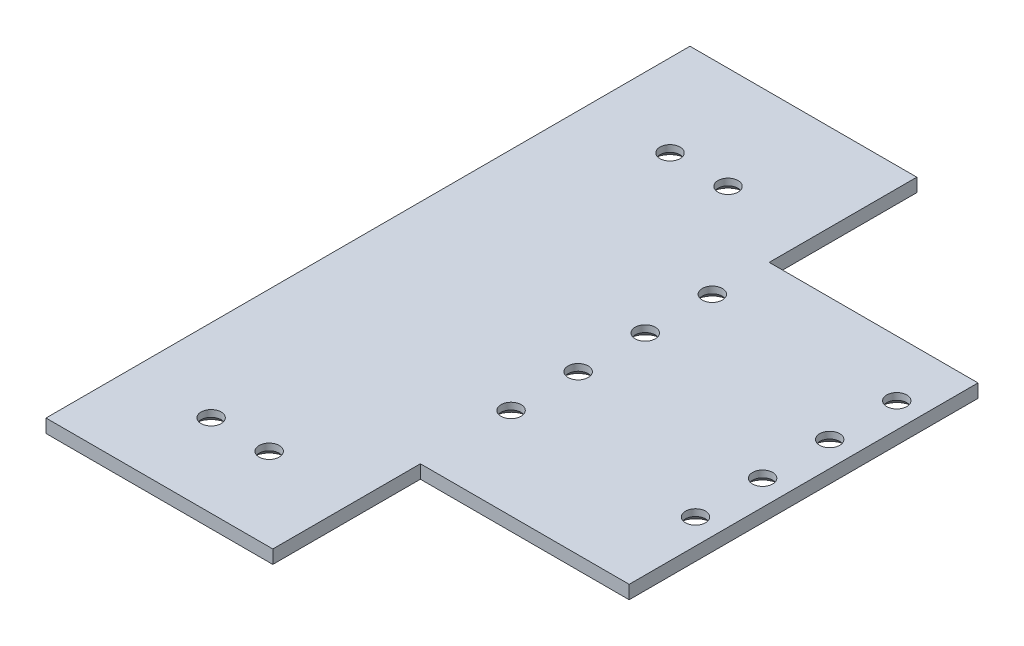
ISO-10303-21;
HEADER;
FILE_DESCRIPTION(('STEP AP214'),'2;1');
FILE_NAME('part.step','',(''),(''),'','','');
FILE_SCHEMA(('AUTOMOTIVE_DESIGN { 1 0 10303 214 1 1 1 1 }'));
ENDSEC;
DATA;
#1=APPLICATION_CONTEXT('core data for automotive mechanical design processes');
#2=APPLICATION_PROTOCOL_DEFINITION('international standard','automotive_design',2000,#1);
#3=PRODUCT_CONTEXT('',#1,'mechanical');
#4=PRODUCT('Part','Part','',(#3));
#5=PRODUCT_RELATED_PRODUCT_CATEGORY('part','',(#4));
#6=PRODUCT_DEFINITION_FORMATION('','',#4);
#7=PRODUCT_DEFINITION_CONTEXT('part definition',#1,'design');
#8=PRODUCT_DEFINITION('design','',#6,#7);
#9=PRODUCT_DEFINITION_SHAPE('','',#8);
#10=(LENGTH_UNIT() NAMED_UNIT(*) SI_UNIT(.MILLI.,.METRE.));
#11=(NAMED_UNIT(*) PLANE_ANGLE_UNIT() SI_UNIT($,.RADIAN.));
#12=(NAMED_UNIT(*) SI_UNIT($,.STERADIAN.) SOLID_ANGLE_UNIT());
#13=UNCERTAINTY_MEASURE_WITH_UNIT(LENGTH_MEASURE(1.E-05),#10,'distance_accuracy_value','');
#14=(GEOMETRIC_REPRESENTATION_CONTEXT(3) GLOBAL_UNCERTAINTY_ASSIGNED_CONTEXT((#13)) GLOBAL_UNIT_ASSIGNED_CONTEXT((#10,
#11,#12)) REPRESENTATION_CONTEXT('',''));
#15=CARTESIAN_POINT('',(0.,0.,0.));
#16=DIRECTION('',(0.,0.,1.));
#17=DIRECTION('',(1.,0.,0.));
#18=AXIS2_PLACEMENT_3D('',#15,#16,#17);
#19=CARTESIAN_POINT('',(0.,2.,0.));
#20=DIRECTION('',(0.,-1.,0.));
#21=DIRECTION('',(0.,0.,-1.));
#22=AXIS2_PLACEMENT_3D('',#19,#20,#21);
#23=PLANE('',#22);
#24=CARTESIAN_POINT('',(5.92356900920418,2.,35.6602207894241));
#25=DIRECTION('',(0.,1.,0.));
#26=DIRECTION('',(0.,0.,1.));
#27=AXIS2_PLACEMENT_3D('',#24,#25,#26);
#28=CIRCLE('',#27,1.5);
#29=CARTESIAN_POINT('',(5.92356900920418,2.,37.1602207894241));
#30=VERTEX_POINT('',#29);
#31=EDGE_CURVE('E350',#30,#30,#28,.T.);
#32=ORIENTED_EDGE('',*,*,#31,.F.);
#33=EDGE_LOOP('',(#32));
#34=FACE_BOUND('',#33,.T.);
#35=CARTESIAN_POINT('',(-2.72643099079582,2.,35.6602207894241));
#36=DIRECTION('',(0.,1.,0.));
#37=DIRECTION('',(0.,0.,1.));
#38=AXIS2_PLACEMENT_3D('',#35,#36,#37);
#39=CIRCLE('',#38,1.5);
#40=CARTESIAN_POINT('',(-2.72643099079582,2.,37.1602207894241));
#41=VERTEX_POINT('',#40);
#42=EDGE_CURVE('E348',#41,#41,#39,.T.);
#43=ORIENTED_EDGE('',*,*,#42,.F.);
#44=EDGE_LOOP('',(#43));
#45=FACE_BOUND('',#44,.T.);
#46=CARTESIAN_POINT('',(-2.72643099079582,2.,-32.7469767878305));
#47=DIRECTION('',(0.,1.,0.));
#48=DIRECTION('',(0.,0.,1.));
#49=AXIS2_PLACEMENT_3D('',#46,#47,#48);
#50=CIRCLE('',#49,1.5);
#51=CARTESIAN_POINT('',(-2.72643099079582,2.,-31.2469767878306));
#52=VERTEX_POINT('',#51);
#53=EDGE_CURVE('E349',#52,#52,#50,.T.);
#54=ORIENTED_EDGE('',*,*,#53,.F.);
#55=EDGE_LOOP('',(#54));
#56=FACE_BOUND('',#55,.T.);
#57=CARTESIAN_POINT('',(5.92356900920418,2.,-32.7469767878305));
#58=DIRECTION('',(0.,1.,0.));
#59=DIRECTION('',(0.,0.,1.));
#60=AXIS2_PLACEMENT_3D('',#57,#58,#59);
#61=CIRCLE('',#60,1.5);
#62=CARTESIAN_POINT('',(5.92356900920418,2.,-31.2469767878306));
#63=VERTEX_POINT('',#62);
#64=EDGE_CURVE('E353',#63,#63,#61,.T.);
#65=ORIENTED_EDGE('',*,*,#64,.F.);
#66=EDGE_LOOP('',(#65));
#67=FACE_BOUND('',#66,.T.);
#68=CARTESIAN_POINT('',(46.1837979810763,2.,-7.64268732355639));
#69=DIRECTION('',(0.,1.,0.));
#70=DIRECTION('',(0.,0.,1.));
#71=AXIS2_PLACEMENT_3D('',#68,#69,#70);
#72=CIRCLE('',#71,1.5000000000188);
#73=CARTESIAN_POINT('',(46.1837979810763,2.,-6.14268732353758));
#74=VERTEX_POINT('',#73);
#75=EDGE_CURVE('E369',#74,#74,#72,.T.);
#76=ORIENTED_EDGE('',*,*,#75,.F.);
#77=EDGE_LOOP('',(#76));
#78=FACE_BOUND('',#77,.T.);
#79=CARTESIAN_POINT('',(18.6837979810763,2.,2.35731267644361));
#80=DIRECTION('',(0.,1.,0.));
#81=DIRECTION('',(0.,0.,1.));
#82=AXIS2_PLACEMENT_3D('',#79,#80,#81);
#83=CIRCLE('',#82,1.50000000001833);
#84=CARTESIAN_POINT('',(18.6837979810763,2.,3.85731267646194));
#85=VERTEX_POINT('',#84);
#86=EDGE_CURVE('E372',#85,#85,#83,.T.);
#87=ORIENTED_EDGE('',*,*,#86,.F.);
#88=EDGE_LOOP('',(#87));
#89=FACE_BOUND('',#88,.T.);
#90=CARTESIAN_POINT('',(46.1837979810763,2.,2.35731267644361));
#91=DIRECTION('',(0.,1.,0.));
#92=DIRECTION('',(0.,0.,1.));
#93=AXIS2_PLACEMENT_3D('',#90,#91,#92);
#94=CIRCLE('',#93,1.5000000000188);
#95=CARTESIAN_POINT('',(46.1837979810763,2.,3.85731267646242));
#96=VERTEX_POINT('',#95);
#97=EDGE_CURVE('E375',#96,#96,#94,.T.);
#98=ORIENTED_EDGE('',*,*,#97,.F.);
#99=EDGE_LOOP('',(#98));
#100=FACE_BOUND('',#99,.T.);
#101=CARTESIAN_POINT('',(18.6837979810764,2.,12.3573126764436));
#102=DIRECTION('',(0.,1.,0.));
#103=DIRECTION('',(0.,0.,1.));
#104=AXIS2_PLACEMENT_3D('',#101,#102,#103);
#105=CIRCLE('',#104,1.50000000001833);
#106=CARTESIAN_POINT('',(18.6837979810764,2.,13.8573126764619));
#107=VERTEX_POINT('',#106);
#108=EDGE_CURVE('E378',#107,#107,#105,.T.);
#109=ORIENTED_EDGE('',*,*,#108,.F.);
#110=EDGE_LOOP('',(#109));
#111=FACE_BOUND('',#110,.T.);
#112=CARTESIAN_POINT('',(18.6837979810763,2.,-17.6426873235564));
#113=DIRECTION('',(0.,1.,0.));
#114=DIRECTION('',(0.,0.,1.));
#115=AXIS2_PLACEMENT_3D('',#112,#113,#114);
#116=CIRCLE('',#115,1.50000000001833);
#117=CARTESIAN_POINT('',(18.6837979810763,2.,-16.1426873235381));
#118=VERTEX_POINT('',#117);
#119=EDGE_CURVE('E362',#118,#118,#116,.T.);
#120=ORIENTED_EDGE('',*,*,#119,.F.);
#121=EDGE_LOOP('',(#120));
#122=FACE_BOUND('',#121,.T.);
#123=CARTESIAN_POINT('',(46.1837979810762,2.,-17.6426873235564));
#124=DIRECTION('',(0.,1.,0.));
#125=DIRECTION('',(0.,0.,1.));
#126=AXIS2_PLACEMENT_3D('',#123,#124,#125);
#127=CIRCLE('',#126,1.5000000000188);
#128=CARTESIAN_POINT('',(46.1837979810762,2.,-16.1426873235376));
#129=VERTEX_POINT('',#128);
#130=EDGE_CURVE('E365',#129,#129,#127,.T.);
#131=ORIENTED_EDGE('',*,*,#130,.F.);
#132=EDGE_LOOP('',(#131));
#133=FACE_BOUND('',#132,.T.);
#134=CARTESIAN_POINT('',(18.6837979810763,2.,-7.64268732355639));
#135=DIRECTION('',(0.,1.,0.));
#136=DIRECTION('',(0.,0.,1.));
#137=AXIS2_PLACEMENT_3D('',#134,#135,#136);
#138=CIRCLE('',#137,1.50000000001833);
#139=CARTESIAN_POINT('',(18.6837979810763,2.,-6.14268732353806));
#140=VERTEX_POINT('',#139);
#141=EDGE_CURVE('E366',#140,#140,#138,.T.);
#142=ORIENTED_EDGE('',*,*,#141,.F.);
#143=EDGE_LOOP('',(#142));
#144=FACE_BOUND('',#143,.T.);
#145=CARTESIAN_POINT('',(46.1837979810764,2.,12.3573126764436));
#146=DIRECTION('',(0.,1.,0.));
#147=DIRECTION('',(0.,0.,1.));
#148=AXIS2_PLACEMENT_3D('',#145,#146,#147);
#149=CIRCLE('',#148,1.5000000000188);
#150=CARTESIAN_POINT('',(46.1837979810764,2.,13.8573126764624));
#151=VERTEX_POINT('',#150);
#152=EDGE_CURVE('E142',#151,#151,#149,.T.);
#153=ORIENTED_EDGE('',*,*,#152,.F.);
#154=EDGE_LOOP('',(#153));
#155=FACE_BOUND('',#154,.T.);
#156=DIRECTION('',(-1.,0.,0.));
#157=VECTOR('',#156,1.);
#158=CARTESIAN_POINT('',(15.,2.,-47.9999999999483));
#159=LINE('',#158,#157);
#160=CARTESIAN_POINT('',(18.8099324408469,2.,-47.9999999999483));
#161=VERTEX_POINT('',#160);
#162=CARTESIAN_POINT('',(-15.0020752239317,2.,-47.9999999999483));
#163=VERTEX_POINT('',#162);
#164=EDGE_CURVE('E133',#161,#163,#159,.T.);
#165=ORIENTED_EDGE('',*,*,#164,.T.);
#166=DIRECTION('',(0.,0.,-1.));
#167=VECTOR('',#166,1.);
#168=CARTESIAN_POINT('',(-15.0020752239318,2.,-47.9999999999483));
#169=LINE('',#168,#167);
#170=CARTESIAN_POINT('',(-15.0020752239317,2.,48.0000000000413));
#171=VERTEX_POINT('',#170);
#172=EDGE_CURVE('E55',#171,#163,#169,.T.);
#173=ORIENTED_EDGE('',*,*,#172,.F.);
#174=DIRECTION('',(1.,0.,0.));
#175=VECTOR('',#174,1.);
#176=CARTESIAN_POINT('',(-48.9590812442226,2.,48.0000000000413));
#177=LINE('',#176,#175);
#178=CARTESIAN_POINT('',(18.8099324408469,2.,48.0000000000413));
#179=VERTEX_POINT('',#178);
#180=EDGE_CURVE('E99',#171,#179,#177,.T.);
#181=ORIENTED_EDGE('',*,*,#180,.T.);
#182=DIRECTION('',(0.,0.,-1.));
#183=VECTOR('',#182,1.);
#184=CARTESIAN_POINT('',(18.8099324408469,2.,26.000000000037));
#185=LINE('',#184,#183);
#186=CARTESIAN_POINT('',(18.8099324408469,2.,26.000000000037));
#187=VERTEX_POINT('',#186);
#188=EDGE_CURVE('E386',#179,#187,#185,.T.);
#189=ORIENTED_EDGE('',*,*,#188,.T.);
#190=DIRECTION('',(1.,0.,0.));
#191=VECTOR('',#190,1.);
#192=CARTESIAN_POINT('',(49.9337979810974,2.,26.000000000037));
#193=LINE('',#192,#191);
#194=CARTESIAN_POINT('',(49.9337979810974,2.,26.000000000037));
#195=VERTEX_POINT('',#194);
#196=EDGE_CURVE('E115',#187,#195,#193,.T.);
#197=ORIENTED_EDGE('',*,*,#196,.T.);
#198=DIRECTION('',(0.,0.,-1.));
#199=VECTOR('',#198,1.);
#200=CARTESIAN_POINT('',(49.9337979810974,2.,-25.9999999999439));
#201=LINE('',#200,#199);
#202=CARTESIAN_POINT('',(49.9337979810974,2.,-25.9999999999439));
#203=VERTEX_POINT('',#202);
#204=EDGE_CURVE('E109',#195,#203,#201,.T.);
#205=ORIENTED_EDGE('',*,*,#204,.T.);
#206=DIRECTION('',(-1.,0.,0.));
#207=VECTOR('',#206,1.);
#208=CARTESIAN_POINT('',(49.9337979810974,2.,-25.9999999999439));
#209=LINE('',#208,#207);
#210=CARTESIAN_POINT('',(18.8099324408469,2.,-25.9999999999439));
#211=VERTEX_POINT('',#210);
#212=EDGE_CURVE('E112',#203,#211,#209,.T.);
#213=ORIENTED_EDGE('',*,*,#212,.T.);
#214=DIRECTION('',(0.,0.,-1.));
#215=VECTOR('',#214,1.);
#216=CARTESIAN_POINT('',(18.8099324408469,2.,-25.9999999999439));
#217=LINE('',#216,#215);
#218=EDGE_CURVE('E64',#211,#161,#217,.T.);
#219=ORIENTED_EDGE('',*,*,#218,.T.);
#220=EDGE_LOOP('',(#165,#173,#181,#189,#197,#205,#213,#219));
#221=FACE_BOUND('',#220,.T.);
#222=ADVANCED_FACE('F39',(#34,#45,#56,#67,#78,#89,#100,#111,#122,#133,#144,#155,#221),#23,.F.);
#223=CARTESIAN_POINT('',(0.,0.,0.));
#224=DIRECTION('',(0.,-1.,0.));
#225=DIRECTION('',(0.,0.,-1.));
#226=AXIS2_PLACEMENT_3D('',#223,#224,#225);
#227=PLANE('',#226);
#228=CARTESIAN_POINT('',(-2.72643099079582,0.,35.6602207894241));
#229=DIRECTION('',(0.,-1.,0.));
#230=DIRECTION('',(0.,0.,-1.));
#231=AXIS2_PLACEMENT_3D('',#228,#229,#230);
#232=CIRCLE('',#231,2.5);
#233=CARTESIAN_POINT('',(-2.72643099079582,0.,33.1602207894241));
#234=VERTEX_POINT('',#233);
#235=EDGE_CURVE('E222',#234,#234,#232,.F.);
#236=ORIENTED_EDGE('',*,*,#235,.T.);
#237=EDGE_LOOP('',(#236));
#238=FACE_BOUND('',#237,.T.);
#239=CARTESIAN_POINT('',(5.92356900920418,0.,35.6602207894241));
#240=DIRECTION('',(0.,-1.,0.));
#241=DIRECTION('',(0.,0.,-1.));
#242=AXIS2_PLACEMENT_3D('',#239,#240,#241);
#243=CIRCLE('',#242,2.5);
#244=CARTESIAN_POINT('',(5.92356900920418,0.,33.1602207894241));
#245=VERTEX_POINT('',#244);
#246=EDGE_CURVE('E219',#245,#245,#243,.F.);
#247=ORIENTED_EDGE('',*,*,#246,.T.);
#248=EDGE_LOOP('',(#247));
#249=FACE_BOUND('',#248,.T.);
#250=CARTESIAN_POINT('',(-2.72643099079582,0.,-32.7469767878305));
#251=DIRECTION('',(0.,-1.,0.));
#252=DIRECTION('',(0.,0.,-1.));
#253=AXIS2_PLACEMENT_3D('',#250,#251,#252);
#254=CIRCLE('',#253,2.5);
#255=CARTESIAN_POINT('',(-2.72643099079582,0.,-35.2469767878305));
#256=VERTEX_POINT('',#255);
#257=EDGE_CURVE('E216',#256,#256,#254,.F.);
#258=ORIENTED_EDGE('',*,*,#257,.T.);
#259=EDGE_LOOP('',(#258));
#260=FACE_BOUND('',#259,.T.);
#261=CARTESIAN_POINT('',(5.92356900920418,0.,-32.7469767878305));
#262=DIRECTION('',(0.,-1.,0.));
#263=DIRECTION('',(0.,0.,-1.));
#264=AXIS2_PLACEMENT_3D('',#261,#262,#263);
#265=CIRCLE('',#264,2.5);
#266=CARTESIAN_POINT('',(5.92356900920418,0.,-35.2469767878305));
#267=VERTEX_POINT('',#266);
#268=EDGE_CURVE('E213',#267,#267,#265,.F.);
#269=ORIENTED_EDGE('',*,*,#268,.T.);
#270=EDGE_LOOP('',(#269));
#271=FACE_BOUND('',#270,.T.);
#272=DIRECTION('',(0.,0.,1.));
#273=VECTOR('',#272,1.);
#274=CARTESIAN_POINT('',(-15.0020752239317,0.,0.));
#275=LINE('',#274,#273);
#276=CARTESIAN_POINT('',(-15.0020752239318,0.,-47.9999999999483));
#277=VERTEX_POINT('',#276);
#278=CARTESIAN_POINT('',(-15.0020752239317,0.,48.0000000000413));
#279=VERTEX_POINT('',#278);
#280=EDGE_CURVE('E356',#277,#279,#275,.T.);
#281=ORIENTED_EDGE('',*,*,#280,.F.);
#282=DIRECTION('',(-1.,0.,0.));
#283=VECTOR('',#282,1.);
#284=CARTESIAN_POINT('',(-48.9590812442226,0.,-47.9999999999483));
#285=LINE('',#284,#283);
#286=CARTESIAN_POINT('',(18.8099324408469,0.,-47.9999999999483));
#287=VERTEX_POINT('',#286);
#288=EDGE_CURVE('E92',#287,#277,#285,.T.);
#289=ORIENTED_EDGE('',*,*,#288,.F.);
#290=DIRECTION('',(0.,0.,-1.));
#291=VECTOR('',#290,1.);
#292=CARTESIAN_POINT('',(18.8099324408469,0.,-25.9999999999439));
#293=LINE('',#292,#291);
#294=CARTESIAN_POINT('',(18.8099324408469,0.,-25.9999999999439));
#295=VERTEX_POINT('',#294);
#296=EDGE_CURVE('E149',#295,#287,#293,.T.);
#297=ORIENTED_EDGE('',*,*,#296,.F.);
#298=DIRECTION('',(-1.,0.,0.));
#299=VECTOR('',#298,1.);
#300=CARTESIAN_POINT('',(49.9337979810974,0.,-25.9999999999439));
#301=LINE('',#300,#299);
#302=CARTESIAN_POINT('',(49.9337979810974,0.,-25.9999999999439));
#303=VERTEX_POINT('',#302);
#304=EDGE_CURVE('E147',#303,#295,#301,.T.);
#305=ORIENTED_EDGE('',*,*,#304,.F.);
#306=DIRECTION('',(0.,0.,-1.));
#307=VECTOR('',#306,1.);
#308=CARTESIAN_POINT('',(49.9337979810974,0.,-25.9999999999439));
#309=LINE('',#308,#307);
#310=CARTESIAN_POINT('',(49.9337979810974,0.,26.000000000037));
#311=VERTEX_POINT('',#310);
#312=EDGE_CURVE('E124',#311,#303,#309,.T.);
#313=ORIENTED_EDGE('',*,*,#312,.F.);
#314=DIRECTION('',(1.,0.,0.));
#315=VECTOR('',#314,1.);
#316=CARTESIAN_POINT('',(49.9337979810974,0.,26.000000000037));
#317=LINE('',#316,#315);
#318=CARTESIAN_POINT('',(18.8099324408469,0.,26.000000000037));
#319=VERTEX_POINT('',#318);
#320=EDGE_CURVE('E144',#319,#311,#317,.T.);
#321=ORIENTED_EDGE('',*,*,#320,.F.);
#322=DIRECTION('',(0.,0.,-1.));
#323=VECTOR('',#322,1.);
#324=CARTESIAN_POINT('',(18.8099324408469,0.,26.000000000037));
#325=LINE('',#324,#323);
#326=CARTESIAN_POINT('',(18.8099324408469,0.,48.0000000000413));
#327=VERTEX_POINT('',#326);
#328=EDGE_CURVE('E141',#327,#319,#325,.T.);
#329=ORIENTED_EDGE('',*,*,#328,.F.);
#330=DIRECTION('',(1.,0.,0.));
#331=VECTOR('',#330,1.);
#332=CARTESIAN_POINT('',(15.,0.,48.0000000000413));
#333=LINE('',#332,#331);
#334=EDGE_CURVE('E139',#279,#327,#333,.T.);
#335=ORIENTED_EDGE('',*,*,#334,.F.);
#336=EDGE_LOOP('',(#281,#289,#297,#305,#313,#321,#329,#335));
#337=FACE_BOUND('',#336,.T.);
#338=CARTESIAN_POINT('',(18.6837979810763,0.,-17.6426873235564));
#339=DIRECTION('',(0.,-1.,0.));
#340=DIRECTION('',(0.,0.,-1.));
#341=AXIS2_PLACEMENT_3D('',#338,#339,#340);
#342=CIRCLE('',#341,2.50000000001834);
#343=CARTESIAN_POINT('',(18.6837979810763,0.,-20.1426873235747));
#344=VERTEX_POINT('',#343);
#345=EDGE_CURVE('E186',#344,#344,#342,.F.);
#346=ORIENTED_EDGE('',*,*,#345,.T.);
#347=EDGE_LOOP('',(#346));
#348=FACE_BOUND('',#347,.T.);
#349=CARTESIAN_POINT('',(18.6837979810763,0.,-7.64268732355639));
#350=DIRECTION('',(0.,-1.,0.));
#351=DIRECTION('',(0.,0.,-1.));
#352=AXIS2_PLACEMENT_3D('',#349,#350,#351);
#353=CIRCLE('',#352,2.50000000001834);
#354=CARTESIAN_POINT('',(18.6837979810763,0.,-10.1426873235747));
#355=VERTEX_POINT('',#354);
#356=EDGE_CURVE('E183',#355,#355,#353,.F.);
#357=ORIENTED_EDGE('',*,*,#356,.T.);
#358=EDGE_LOOP('',(#357));
#359=FACE_BOUND('',#358,.T.);
#360=CARTESIAN_POINT('',(18.6837979810763,0.,2.35731267644361));
#361=DIRECTION('',(0.,-1.,0.));
#362=DIRECTION('',(0.,0.,-1.));
#363=AXIS2_PLACEMENT_3D('',#360,#361,#362);
#364=CIRCLE('',#363,2.50000000001834);
#365=CARTESIAN_POINT('',(18.6837979810763,0.,-0.142687323574732));
#366=VERTEX_POINT('',#365);
#367=EDGE_CURVE('E180',#366,#366,#364,.F.);
#368=ORIENTED_EDGE('',*,*,#367,.T.);
#369=EDGE_LOOP('',(#368));
#370=FACE_BOUND('',#369,.T.);
#371=CARTESIAN_POINT('',(18.6837979810764,0.,12.3573126764436));
#372=DIRECTION('',(0.,-1.,0.));
#373=DIRECTION('',(0.,0.,-1.));
#374=AXIS2_PLACEMENT_3D('',#371,#372,#373);
#375=CIRCLE('',#374,2.50000000001834);
#376=CARTESIAN_POINT('',(18.6837979810764,0.,9.85731267642527));
#377=VERTEX_POINT('',#376);
#378=EDGE_CURVE('E177',#377,#377,#375,.F.);
#379=ORIENTED_EDGE('',*,*,#378,.T.);
#380=EDGE_LOOP('',(#379));
#381=FACE_BOUND('',#380,.T.);
#382=CARTESIAN_POINT('',(46.1837979810762,0.,-17.6426873235564));
#383=DIRECTION('',(0.,-1.,0.));
#384=DIRECTION('',(0.,0.,-1.));
#385=AXIS2_PLACEMENT_3D('',#382,#383,#384);
#386=CIRCLE('',#385,2.50000000001882);
#387=CARTESIAN_POINT('',(46.1837979810762,0.,-20.1426873235752));
#388=VERTEX_POINT('',#387);
#389=EDGE_CURVE('E174',#388,#388,#386,.F.);
#390=ORIENTED_EDGE('',*,*,#389,.T.);
#391=EDGE_LOOP('',(#390));
#392=FACE_BOUND('',#391,.T.);
#393=CARTESIAN_POINT('',(46.1837979810763,0.,-7.64268732355639));
#394=DIRECTION('',(0.,-1.,0.));
#395=DIRECTION('',(0.,0.,-1.));
#396=AXIS2_PLACEMENT_3D('',#393,#394,#395);
#397=CIRCLE('',#396,2.50000000001882);
#398=CARTESIAN_POINT('',(46.1837979810763,0.,-10.1426873235752));
#399=VERTEX_POINT('',#398);
#400=EDGE_CURVE('E171',#399,#399,#397,.F.);
#401=ORIENTED_EDGE('',*,*,#400,.T.);
#402=EDGE_LOOP('',(#401));
#403=FACE_BOUND('',#402,.T.);
#404=CARTESIAN_POINT('',(46.1837979810763,0.,2.35731267644361));
#405=DIRECTION('',(0.,-1.,0.));
#406=DIRECTION('',(0.,0.,-1.));
#407=AXIS2_PLACEMENT_3D('',#404,#405,#406);
#408=CIRCLE('',#407,2.50000000001882);
#409=CARTESIAN_POINT('',(46.1837979810763,0.,-0.142687323575211));
#410=VERTEX_POINT('',#409);
#411=EDGE_CURVE('E168',#410,#410,#408,.F.);
#412=ORIENTED_EDGE('',*,*,#411,.T.);
#413=EDGE_LOOP('',(#412));
#414=FACE_BOUND('',#413,.T.);
#415=CARTESIAN_POINT('',(46.1837979810764,0.,12.3573126764436));
#416=DIRECTION('',(0.,-1.,0.));
#417=DIRECTION('',(0.,0.,-1.));
#418=AXIS2_PLACEMENT_3D('',#415,#416,#417);
#419=CIRCLE('',#418,2.50000000001882);
#420=CARTESIAN_POINT('',(46.1837979810764,0.,9.85731267642479));
#421=VERTEX_POINT('',#420);
#422=EDGE_CURVE('E165',#421,#421,#419,.F.);
#423=ORIENTED_EDGE('',*,*,#422,.T.);
#424=EDGE_LOOP('',(#423));
#425=FACE_BOUND('',#424,.T.);
#426=ADVANCED_FACE('F248',(#238,#249,#260,#271,#337,#348,#359,#370,#381,#392,#403,#414,#425),
#227,.T.);
#427=CARTESIAN_POINT('',(15.,2.,48.0000000000413));
#428=DIRECTION('',(0.,0.,-1.));
#429=DIRECTION('',(-1.,0.,0.));
#430=AXIS2_PLACEMENT_3D('',#427,#428,#429);
#431=PLANE('',#430);
#432=ORIENTED_EDGE('',*,*,#180,.F.);
#433=DIRECTION('',(0.,1.,0.));
#434=VECTOR('',#433,1.);
#435=CARTESIAN_POINT('',(-15.0020752239317,-8.,48.0000000000413));
#436=LINE('',#435,#434);
#437=EDGE_CURVE('E399',#279,#171,#436,.T.);
#438=ORIENTED_EDGE('',*,*,#437,.F.);
#439=ORIENTED_EDGE('',*,*,#334,.T.);
#440=DIRECTION('',(0.,-1.,0.));
#441=VECTOR('',#440,1.);
#442=CARTESIAN_POINT('',(18.8099324408469,2.,48.0000000000413));
#443=LINE('',#442,#441);
#444=EDGE_CURVE('E159',#179,#327,#443,.T.);
#445=ORIENTED_EDGE('',*,*,#444,.F.);
#446=EDGE_LOOP('',(#432,#438,#439,#445));
#447=FACE_BOUND('',#446,.T.);
#448=ADVANCED_FACE('F254',(#447),#431,.F.);
#449=CARTESIAN_POINT('',(18.8099324408469,2.,26.000000000037));
#450=DIRECTION('',(-1.,0.,0.));
#451=DIRECTION('',(0.,0.,1.));
#452=AXIS2_PLACEMENT_3D('',#449,#450,#451);
#453=PLANE('',#452);
#454=ORIENTED_EDGE('',*,*,#328,.T.);
#455=DIRECTION('',(0.,-1.,0.));
#456=VECTOR('',#455,1.);
#457=CARTESIAN_POINT('',(18.8099324408469,2.,26.000000000037));
#458=LINE('',#457,#456);
#459=EDGE_CURVE('E156',#187,#319,#458,.T.);
#460=ORIENTED_EDGE('',*,*,#459,.F.);
#461=ORIENTED_EDGE('',*,*,#188,.F.);
#462=ORIENTED_EDGE('',*,*,#444,.T.);
#463=EDGE_LOOP('',(#454,#460,#461,#462));
#464=FACE_BOUND('',#463,.T.);
#465=ADVANCED_FACE('F278',(#464),#453,.F.);
#466=CARTESIAN_POINT('',(49.9337979810974,2.,26.000000000037));
#467=DIRECTION('',(0.,0.,-1.));
#468=DIRECTION('',(-1.,0.,0.));
#469=AXIS2_PLACEMENT_3D('',#466,#467,#468);
#470=PLANE('',#469);
#471=ORIENTED_EDGE('',*,*,#320,.T.);
#472=DIRECTION('',(0.,-1.,0.));
#473=VECTOR('',#472,1.);
#474=CARTESIAN_POINT('',(49.9337979810974,2.,26.000000000037));
#475=LINE('',#474,#473);
#476=EDGE_CURVE('E127',#195,#311,#475,.T.);
#477=ORIENTED_EDGE('',*,*,#476,.F.);
#478=ORIENTED_EDGE('',*,*,#196,.F.);
#479=ORIENTED_EDGE('',*,*,#459,.T.);
#480=EDGE_LOOP('',(#471,#477,#478,#479));
#481=FACE_BOUND('',#480,.T.);
#482=ADVANCED_FACE('F275',(#481),#470,.F.);
#483=CARTESIAN_POINT('',(49.9337979810974,2.,-25.9999999999439));
#484=DIRECTION('',(-1.,0.,0.));
#485=DIRECTION('',(0.,0.,1.));
#486=AXIS2_PLACEMENT_3D('',#483,#484,#485);
#487=PLANE('',#486);
#488=ORIENTED_EDGE('',*,*,#312,.T.);
#489=DIRECTION('',(0.,-1.,0.));
#490=VECTOR('',#489,1.);
#491=CARTESIAN_POINT('',(49.9337979810974,2.,-25.9999999999439));
#492=LINE('',#491,#490);
#493=EDGE_CURVE('E121',#203,#303,#492,.T.);
#494=ORIENTED_EDGE('',*,*,#493,.F.);
#495=ORIENTED_EDGE('',*,*,#204,.F.);
#496=ORIENTED_EDGE('',*,*,#476,.T.);
#497=EDGE_LOOP('',(#488,#494,#495,#496));
#498=FACE_BOUND('',#497,.T.);
#499=ADVANCED_FACE('F122',(#498),#487,.F.);
#500=CARTESIAN_POINT('',(49.9337979810974,2.,-25.9999999999439));
#501=DIRECTION('',(0.,0.,1.));
#502=DIRECTION('',(1.,0.,0.));
#503=AXIS2_PLACEMENT_3D('',#500,#501,#502);
#504=PLANE('',#503);
#505=ORIENTED_EDGE('',*,*,#304,.T.);
#506=DIRECTION('',(0.,-1.,0.));
#507=VECTOR('',#506,1.);
#508=CARTESIAN_POINT('',(18.8099324408469,2.,-25.9999999999439));
#509=LINE('',#508,#507);
#510=EDGE_CURVE('E128',#211,#295,#509,.T.);
#511=ORIENTED_EDGE('',*,*,#510,.F.);
#512=ORIENTED_EDGE('',*,*,#212,.F.);
#513=ORIENTED_EDGE('',*,*,#493,.T.);
#514=EDGE_LOOP('',(#505,#511,#512,#513));
#515=FACE_BOUND('',#514,.T.);
#516=ADVANCED_FACE('F130',(#515),#504,.F.);
#517=CARTESIAN_POINT('',(18.8099324408469,2.,-25.9999999999439));
#518=DIRECTION('',(-1.,0.,0.));
#519=DIRECTION('',(0.,0.,1.));
#520=AXIS2_PLACEMENT_3D('',#517,#518,#519);
#521=PLANE('',#520);
#522=ORIENTED_EDGE('',*,*,#296,.T.);
#523=DIRECTION('',(0.,-1.,0.));
#524=VECTOR('',#523,1.);
#525=CARTESIAN_POINT('',(18.8099324408469,2.,-47.9999999999483));
#526=LINE('',#525,#524);
#527=EDGE_CURVE('E138',#161,#287,#526,.T.);
#528=ORIENTED_EDGE('',*,*,#527,.F.);
#529=ORIENTED_EDGE('',*,*,#218,.F.);
#530=ORIENTED_EDGE('',*,*,#510,.T.);
#531=EDGE_LOOP('',(#522,#528,#529,#530));
#532=FACE_BOUND('',#531,.T.);
#533=ADVANCED_FACE('F266',(#532),#521,.F.);
#534=CARTESIAN_POINT('',(-48.9590812442226,2.,-47.9999999999483));
#535=DIRECTION('',(0.,0.,1.));
#536=DIRECTION('',(1.,0.,0.));
#537=AXIS2_PLACEMENT_3D('',#534,#535,#536);
#538=PLANE('',#537);
#539=ORIENTED_EDGE('',*,*,#288,.T.);
#540=DIRECTION('',(0.,1.,0.));
#541=VECTOR('',#540,1.);
#542=CARTESIAN_POINT('',(-15.0020752239318,-8.,-47.9999999999483));
#543=LINE('',#542,#541);
#544=EDGE_CURVE('E393',#277,#163,#543,.T.);
#545=ORIENTED_EDGE('',*,*,#544,.T.);
#546=ORIENTED_EDGE('',*,*,#164,.F.);
#547=ORIENTED_EDGE('',*,*,#527,.T.);
#548=EDGE_LOOP('',(#539,#545,#546,#547));
#549=FACE_BOUND('',#548,.T.);
#550=ADVANCED_FACE('F263',(#549),#538,.F.);
#551=CARTESIAN_POINT('',(46.1837979810764,-8.,12.3573126764436));
#552=DIRECTION('',(0.,1.,0.));
#553=DIRECTION('',(0.,0.,1.));
#554=AXIS2_PLACEMENT_3D('',#551,#552,#553);
#555=CYLINDRICAL_SURFACE('',#554,1.5000000000188);
#556=CARTESIAN_POINT('',(46.1837979810764,1.00000000000001,12.3573126764436));
#557=DIRECTION('',(0.,-1.,0.));
#558=DIRECTION('',(0.,0.,-1.));
#559=AXIS2_PLACEMENT_3D('',#556,#557,#558);
#560=CIRCLE('',#559,1.5000000000188);
#561=CARTESIAN_POINT('',(46.1837979810764,1.00000000000001,10.8573126764248));
#562=VERTEX_POINT('',#561);
#563=EDGE_CURVE('E207',#562,#562,#560,.T.);
#564=ORIENTED_EDGE('',*,*,#563,.T.);
#565=EDGE_LOOP('',(#564));
#566=FACE_BOUND('',#565,.T.);
#567=ORIENTED_EDGE('',*,*,#152,.T.);
#568=EDGE_LOOP('',(#567));
#569=FACE_BOUND('',#568,.T.);
#570=ADVANCED_FACE('F260',(#566,#569),#555,.F.);
#571=CARTESIAN_POINT('',(18.6837979810763,-8.,-7.64268732355639));
#572=DIRECTION('',(0.,1.,0.));
#573=DIRECTION('',(0.,0.,1.));
#574=AXIS2_PLACEMENT_3D('',#571,#572,#573);
#575=CYLINDRICAL_SURFACE('',#574,1.50000000001833);
#576=CARTESIAN_POINT('',(18.6837979810763,1.00000000000001,-7.64268732355639));
#577=DIRECTION('',(0.,-1.,0.));
#578=DIRECTION('',(0.,0.,-1.));
#579=AXIS2_PLACEMENT_3D('',#576,#577,#578);
#580=CIRCLE('',#579,1.50000000001833);
#581=CARTESIAN_POINT('',(18.6837979810763,1.00000000000001,-9.14268732357471));
#582=VERTEX_POINT('',#581);
#583=EDGE_CURVE('E189',#582,#582,#580,.T.);
#584=ORIENTED_EDGE('',*,*,#583,.T.);
#585=EDGE_LOOP('',(#584));
#586=FACE_BOUND('',#585,.T.);
#587=ORIENTED_EDGE('',*,*,#141,.T.);
#588=EDGE_LOOP('',(#587));
#589=FACE_BOUND('',#588,.T.);
#590=ADVANCED_FACE('F424',(#586,#589),#575,.F.);
#591=CARTESIAN_POINT('',(46.1837979810762,-8.,-17.6426873235564));
#592=DIRECTION('',(0.,1.,0.));
#593=DIRECTION('',(0.,0.,1.));
#594=AXIS2_PLACEMENT_3D('',#591,#592,#593);
#595=CYLINDRICAL_SURFACE('',#594,1.5000000000188);
#596=CARTESIAN_POINT('',(46.1837979810762,1.00000000000001,-17.6426873235564));
#597=DIRECTION('',(0.,-1.,0.));
#598=DIRECTION('',(0.,0.,-1.));
#599=AXIS2_PLACEMENT_3D('',#596,#597,#598);
#600=CIRCLE('',#599,1.5000000000188);
#601=CARTESIAN_POINT('',(46.1837979810762,1.00000000000001,-19.1426873235752));
#602=VERTEX_POINT('',#601);
#603=EDGE_CURVE('E198',#602,#602,#600,.T.);
#604=ORIENTED_EDGE('',*,*,#603,.T.);
#605=EDGE_LOOP('',(#604));
#606=FACE_BOUND('',#605,.T.);
#607=ORIENTED_EDGE('',*,*,#130,.T.);
#608=EDGE_LOOP('',(#607));
#609=FACE_BOUND('',#608,.T.);
#610=ADVANCED_FACE('F430',(#606,#609),#595,.F.);
#611=CARTESIAN_POINT('',(18.6837979810763,-8.,-17.6426873235564));
#612=DIRECTION('',(0.,1.,0.));
#613=DIRECTION('',(0.,0.,1.));
#614=AXIS2_PLACEMENT_3D('',#611,#612,#613);
#615=CYLINDRICAL_SURFACE('',#614,1.50000000001833);
#616=CARTESIAN_POINT('',(18.6837979810763,1.00000000000001,-17.6426873235564));
#617=DIRECTION('',(0.,-1.,0.));
#618=DIRECTION('',(0.,0.,-1.));
#619=AXIS2_PLACEMENT_3D('',#616,#617,#618);
#620=CIRCLE('',#619,1.50000000001833);
#621=CARTESIAN_POINT('',(18.6837979810763,1.00000000000001,-19.1426873235747));
#622=VERTEX_POINT('',#621);
#623=EDGE_CURVE('E162',#622,#622,#620,.T.);
#624=ORIENTED_EDGE('',*,*,#623,.T.);
#625=EDGE_LOOP('',(#624));
#626=FACE_BOUND('',#625,.T.);
#627=ORIENTED_EDGE('',*,*,#119,.T.);
#628=EDGE_LOOP('',(#627));
#629=FACE_BOUND('',#628,.T.);
#630=ADVANCED_FACE('F436',(#626,#629),#615,.F.);
#631=CARTESIAN_POINT('',(18.6837979810764,-8.,12.3573126764436));
#632=DIRECTION('',(0.,1.,0.));
#633=DIRECTION('',(0.,0.,1.));
#634=AXIS2_PLACEMENT_3D('',#631,#632,#633);
#635=CYLINDRICAL_SURFACE('',#634,1.50000000001833);
#636=CARTESIAN_POINT('',(18.6837979810764,1.00000000000001,12.3573126764436));
#637=DIRECTION('',(0.,-1.,0.));
#638=DIRECTION('',(0.,0.,-1.));
#639=AXIS2_PLACEMENT_3D('',#636,#637,#638);
#640=CIRCLE('',#639,1.50000000001833);
#641=CARTESIAN_POINT('',(18.6837979810764,1.00000000000001,10.8573126764253));
#642=VERTEX_POINT('',#641);
#643=EDGE_CURVE('E195',#642,#642,#640,.T.);
#644=ORIENTED_EDGE('',*,*,#643,.T.);
#645=EDGE_LOOP('',(#644));
#646=FACE_BOUND('',#645,.T.);
#647=ORIENTED_EDGE('',*,*,#108,.T.);
#648=EDGE_LOOP('',(#647));
#649=FACE_BOUND('',#648,.T.);
#650=ADVANCED_FACE('F451',(#646,#649),#635,.F.);
#651=CARTESIAN_POINT('',(46.1837979810763,-8.,2.35731267644361));
#652=DIRECTION('',(0.,1.,0.));
#653=DIRECTION('',(0.,0.,1.));
#654=AXIS2_PLACEMENT_3D('',#651,#652,#653);
#655=CYLINDRICAL_SURFACE('',#654,1.5000000000188);
#656=CARTESIAN_POINT('',(46.1837979810763,1.00000000000001,2.35731267644361));
#657=DIRECTION('',(0.,-1.,0.));
#658=DIRECTION('',(0.,0.,-1.));
#659=AXIS2_PLACEMENT_3D('',#656,#657,#658);
#660=CIRCLE('',#659,1.5000000000188);
#661=CARTESIAN_POINT('',(46.1837979810763,1.00000000000001,0.857312676424807));
#662=VERTEX_POINT('',#661);
#663=EDGE_CURVE('E204',#662,#662,#660,.T.);
#664=ORIENTED_EDGE('',*,*,#663,.T.);
#665=EDGE_LOOP('',(#664));
#666=FACE_BOUND('',#665,.T.);
#667=ORIENTED_EDGE('',*,*,#97,.T.);
#668=EDGE_LOOP('',(#667));
#669=FACE_BOUND('',#668,.T.);
#670=ADVANCED_FACE('F446',(#666,#669),#655,.F.);
#671=CARTESIAN_POINT('',(18.6837979810763,-8.,2.35731267644361));
#672=DIRECTION('',(0.,1.,0.));
#673=DIRECTION('',(0.,0.,1.));
#674=AXIS2_PLACEMENT_3D('',#671,#672,#673);
#675=CYLINDRICAL_SURFACE('',#674,1.50000000001833);
#676=CARTESIAN_POINT('',(18.6837979810763,1.00000000000001,2.35731267644361));
#677=DIRECTION('',(0.,-1.,0.));
#678=DIRECTION('',(0.,0.,-1.));
#679=AXIS2_PLACEMENT_3D('',#676,#677,#678);
#680=CIRCLE('',#679,1.50000000001833);
#681=CARTESIAN_POINT('',(18.6837979810763,1.00000000000001,0.857312676425286));
#682=VERTEX_POINT('',#681);
#683=EDGE_CURVE('E192',#682,#682,#680,.T.);
#684=ORIENTED_EDGE('',*,*,#683,.T.);
#685=EDGE_LOOP('',(#684));
#686=FACE_BOUND('',#685,.T.);
#687=ORIENTED_EDGE('',*,*,#86,.T.);
#688=EDGE_LOOP('',(#687));
#689=FACE_BOUND('',#688,.T.);
#690=ADVANCED_FACE('F443',(#686,#689),#675,.F.);
#691=CARTESIAN_POINT('',(46.1837979810763,-8.,-7.64268732355639));
#692=DIRECTION('',(0.,1.,0.));
#693=DIRECTION('',(0.,0.,1.));
#694=AXIS2_PLACEMENT_3D('',#691,#692,#693);
#695=CYLINDRICAL_SURFACE('',#694,1.5000000000188);
#696=CARTESIAN_POINT('',(46.1837979810763,1.00000000000001,-7.64268732355639));
#697=DIRECTION('',(0.,-1.,0.));
#698=DIRECTION('',(0.,0.,-1.));
#699=AXIS2_PLACEMENT_3D('',#696,#697,#698);
#700=CIRCLE('',#699,1.5000000000188);
#701=CARTESIAN_POINT('',(46.1837979810763,1.00000000000001,-9.14268732357519));
#702=VERTEX_POINT('',#701);
#703=EDGE_CURVE('E201',#702,#702,#700,.T.);
#704=ORIENTED_EDGE('',*,*,#703,.T.);
#705=EDGE_LOOP('',(#704));
#706=FACE_BOUND('',#705,.T.);
#707=ORIENTED_EDGE('',*,*,#75,.T.);
#708=EDGE_LOOP('',(#707));
#709=FACE_BOUND('',#708,.T.);
#710=ADVANCED_FACE('F290',(#706,#709),#695,.F.);
#711=CARTESIAN_POINT('',(18.6837979810763,1.00000000000001,-17.6426873235564));
#712=DIRECTION('',(0.,-1.,0.));
#713=DIRECTION('',(0.,0.,-1.));
#714=AXIS2_PLACEMENT_3D('',#711,#712,#713);
#715=CONICAL_SURFACE('',#714,1.50000000001833,0.785398163397453);
#716=ORIENTED_EDGE('',*,*,#345,.F.);
#717=EDGE_LOOP('',(#716));
#718=FACE_BOUND('',#717,.T.);
#719=ORIENTED_EDGE('',*,*,#623,.F.);
#720=EDGE_LOOP('',(#719));
#721=FACE_BOUND('',#720,.T.);
#722=ADVANCED_FACE('F286',(#718,#721),#715,.F.);
#723=CARTESIAN_POINT('',(18.6837979810763,1.00000000000001,-7.64268732355639));
#724=DIRECTION('',(0.,-1.,0.));
#725=DIRECTION('',(0.,0.,-1.));
#726=AXIS2_PLACEMENT_3D('',#723,#724,#725);
#727=CONICAL_SURFACE('',#726,1.50000000001833,0.785398163397453);
#728=ORIENTED_EDGE('',*,*,#356,.F.);
#729=EDGE_LOOP('',(#728));
#730=FACE_BOUND('',#729,.T.);
#731=ORIENTED_EDGE('',*,*,#583,.F.);
#732=EDGE_LOOP('',(#731));
#733=FACE_BOUND('',#732,.T.);
#734=ADVANCED_FACE('F289',(#730,#733),#727,.F.);
#735=CARTESIAN_POINT('',(18.6837979810763,1.00000000000001,2.35731267644361));
#736=DIRECTION('',(0.,-1.,0.));
#737=DIRECTION('',(0.,0.,-1.));
#738=AXIS2_PLACEMENT_3D('',#735,#736,#737);
#739=CONICAL_SURFACE('',#738,1.50000000001833,0.785398163397453);
#740=ORIENTED_EDGE('',*,*,#367,.F.);
#741=EDGE_LOOP('',(#740));
#742=FACE_BOUND('',#741,.T.);
#743=ORIENTED_EDGE('',*,*,#683,.F.);
#744=EDGE_LOOP('',(#743));
#745=FACE_BOUND('',#744,.T.);
#746=ADVANCED_FACE('F294',(#742,#745),#739,.F.);
#747=CARTESIAN_POINT('',(18.6837979810764,1.00000000000001,12.3573126764436));
#748=DIRECTION('',(0.,-1.,0.));
#749=DIRECTION('',(0.,0.,-1.));
#750=AXIS2_PLACEMENT_3D('',#747,#748,#749);
#751=CONICAL_SURFACE('',#750,1.50000000001833,0.785398163397453);
#752=ORIENTED_EDGE('',*,*,#378,.F.);
#753=EDGE_LOOP('',(#752));
#754=FACE_BOUND('',#753,.T.);
#755=ORIENTED_EDGE('',*,*,#643,.F.);
#756=EDGE_LOOP('',(#755));
#757=FACE_BOUND('',#756,.T.);
#758=ADVANCED_FACE('F298',(#754,#757),#751,.F.);
#759=CARTESIAN_POINT('',(46.1837979810762,1.00000000000001,-17.6426873235564));
#760=DIRECTION('',(0.,-1.,0.));
#761=DIRECTION('',(0.,0.,-1.));
#762=AXIS2_PLACEMENT_3D('',#759,#760,#761);
#763=CONICAL_SURFACE('',#762,1.5000000000188,0.785398163397453);
#764=ORIENTED_EDGE('',*,*,#389,.F.);
#765=EDGE_LOOP('',(#764));
#766=FACE_BOUND('',#765,.T.);
#767=ORIENTED_EDGE('',*,*,#603,.F.);
#768=EDGE_LOOP('',(#767));
#769=FACE_BOUND('',#768,.T.);
#770=ADVANCED_FACE('F302',(#766,#769),#763,.F.);
#771=CARTESIAN_POINT('',(46.1837979810763,1.00000000000001,-7.64268732355639));
#772=DIRECTION('',(0.,-1.,0.));
#773=DIRECTION('',(0.,0.,-1.));
#774=AXIS2_PLACEMENT_3D('',#771,#772,#773);
#775=CONICAL_SURFACE('',#774,1.5000000000188,0.785398163397453);
#776=ORIENTED_EDGE('',*,*,#400,.F.);
#777=EDGE_LOOP('',(#776));
#778=FACE_BOUND('',#777,.T.);
#779=ORIENTED_EDGE('',*,*,#703,.F.);
#780=EDGE_LOOP('',(#779));
#781=FACE_BOUND('',#780,.T.);
#782=ADVANCED_FACE('F306',(#778,#781),#775,.F.);
#783=CARTESIAN_POINT('',(46.1837979810763,1.00000000000001,2.35731267644361));
#784=DIRECTION('',(0.,-1.,0.));
#785=DIRECTION('',(0.,0.,-1.));
#786=AXIS2_PLACEMENT_3D('',#783,#784,#785);
#787=CONICAL_SURFACE('',#786,1.5000000000188,0.785398163397453);
#788=ORIENTED_EDGE('',*,*,#411,.F.);
#789=EDGE_LOOP('',(#788));
#790=FACE_BOUND('',#789,.T.);
#791=ORIENTED_EDGE('',*,*,#663,.F.);
#792=EDGE_LOOP('',(#791));
#793=FACE_BOUND('',#792,.T.);
#794=ADVANCED_FACE('F310',(#790,#793),#787,.F.);
#795=CARTESIAN_POINT('',(46.1837979810764,1.00000000000001,12.3573126764436));
#796=DIRECTION('',(0.,-1.,0.));
#797=DIRECTION('',(0.,0.,-1.));
#798=AXIS2_PLACEMENT_3D('',#795,#796,#797);
#799=CONICAL_SURFACE('',#798,1.5000000000188,0.785398163397453);
#800=ORIENTED_EDGE('',*,*,#422,.F.);
#801=EDGE_LOOP('',(#800));
#802=FACE_BOUND('',#801,.T.);
#803=ORIENTED_EDGE('',*,*,#563,.F.);
#804=EDGE_LOOP('',(#803));
#805=FACE_BOUND('',#804,.T.);
#806=ADVANCED_FACE('F314',(#802,#805),#799,.F.);
#807=CARTESIAN_POINT('',(5.92356900920418,-8.,-32.7469767878305));
#808=DIRECTION('',(0.,1.,0.));
#809=DIRECTION('',(0.,0.,1.));
#810=AXIS2_PLACEMENT_3D('',#807,#808,#809);
#811=CYLINDRICAL_SURFACE('',#810,1.5);
#812=CARTESIAN_POINT('',(5.92356900920418,0.999999999999997,-32.7469767878305));
#813=DIRECTION('',(0.,-1.,0.));
#814=DIRECTION('',(0.,0.,-1.));
#815=AXIS2_PLACEMENT_3D('',#812,#813,#814);
#816=CIRCLE('',#815,1.5);
#817=CARTESIAN_POINT('',(5.92356900920418,0.999999999999997,-34.2469767878305));
#818=VERTEX_POINT('',#817);
#819=EDGE_CURVE('E11',#818,#818,#816,.T.);
#820=ORIENTED_EDGE('',*,*,#819,.T.);
#821=EDGE_LOOP('',(#820));
#822=FACE_BOUND('',#821,.T.);
#823=ORIENTED_EDGE('',*,*,#64,.T.);
#824=EDGE_LOOP('',(#823));
#825=FACE_BOUND('',#824,.T.);
#826=ADVANCED_FACE('F318',(#822,#825),#811,.F.);
#827=CARTESIAN_POINT('',(-2.72643099079582,-8.,-32.7469767878305));
#828=DIRECTION('',(0.,1.,0.));
#829=DIRECTION('',(0.,0.,1.));
#830=AXIS2_PLACEMENT_3D('',#827,#828,#829);
#831=CYLINDRICAL_SURFACE('',#830,1.5);
#832=CARTESIAN_POINT('',(-2.72643099079582,0.999999999999996,-32.7469767878305));
#833=DIRECTION('',(0.,-1.,0.));
#834=DIRECTION('',(0.,0.,-1.));
#835=AXIS2_PLACEMENT_3D('',#832,#833,#834);
#836=CIRCLE('',#835,1.5);
#837=CARTESIAN_POINT('',(-2.72643099079582,0.999999999999996,-34.2469767878305));
#838=VERTEX_POINT('',#837);
#839=EDGE_CURVE('E48',#838,#838,#836,.T.);
#840=ORIENTED_EDGE('',*,*,#839,.T.);
#841=EDGE_LOOP('',(#840));
#842=FACE_BOUND('',#841,.T.);
#843=ORIENTED_EDGE('',*,*,#53,.T.);
#844=EDGE_LOOP('',(#843));
#845=FACE_BOUND('',#844,.T.);
#846=ADVANCED_FACE('F230',(#842,#845),#831,.F.);
#847=CARTESIAN_POINT('',(-2.72643099079582,-8.,35.6602207894241));
#848=DIRECTION('',(0.,1.,0.));
#849=DIRECTION('',(0.,0.,1.));
#850=AXIS2_PLACEMENT_3D('',#847,#848,#849);
#851=CYLINDRICAL_SURFACE('',#850,1.5);
#852=CARTESIAN_POINT('',(-2.72643099079582,0.999999999999992,35.6602207894241));
#853=DIRECTION('',(0.,-1.,0.));
#854=DIRECTION('',(0.,0.,-1.));
#855=AXIS2_PLACEMENT_3D('',#852,#853,#854);
#856=CIRCLE('',#855,1.5);
#857=CARTESIAN_POINT('',(-2.72643099079582,0.999999999999992,34.1602207894241));
#858=VERTEX_POINT('',#857);
#859=EDGE_CURVE('E210',#858,#858,#856,.T.);
#860=ORIENTED_EDGE('',*,*,#859,.T.);
#861=EDGE_LOOP('',(#860));
#862=FACE_BOUND('',#861,.T.);
#863=ORIENTED_EDGE('',*,*,#42,.T.);
#864=EDGE_LOOP('',(#863));
#865=FACE_BOUND('',#864,.T.);
#866=ADVANCED_FACE('F342',(#862,#865),#851,.F.);
#867=CARTESIAN_POINT('',(5.92356900920418,-8.,35.6602207894241));
#868=DIRECTION('',(0.,1.,0.));
#869=DIRECTION('',(0.,0.,1.));
#870=AXIS2_PLACEMENT_3D('',#867,#868,#869);
#871=CYLINDRICAL_SURFACE('',#870,1.5);
#872=CARTESIAN_POINT('',(5.92356900920418,0.999999999999992,35.6602207894241));
#873=DIRECTION('',(0.,-1.,0.));
#874=DIRECTION('',(0.,0.,-1.));
#875=AXIS2_PLACEMENT_3D('',#872,#873,#874);
#876=CIRCLE('',#875,1.5);
#877=CARTESIAN_POINT('',(5.92356900920418,0.999999999999992,34.1602207894241));
#878=VERTEX_POINT('',#877);
#879=EDGE_CURVE('E225',#878,#878,#876,.T.);
#880=ORIENTED_EDGE('',*,*,#879,.T.);
#881=EDGE_LOOP('',(#880));
#882=FACE_BOUND('',#881,.T.);
#883=ORIENTED_EDGE('',*,*,#31,.T.);
#884=EDGE_LOOP('',(#883));
#885=FACE_BOUND('',#884,.T.);
#886=ADVANCED_FACE('F336',(#882,#885),#871,.F.);
#887=CARTESIAN_POINT('',(-15.0020752239318,-8.,-47.9999999999483));
#888=DIRECTION('',(1.,0.,0.));
#889=DIRECTION('',(0.,0.,-1.));
#890=AXIS2_PLACEMENT_3D('',#887,#888,#889);
#891=PLANE('',#890);
#892=ORIENTED_EDGE('',*,*,#280,.T.);
#893=ORIENTED_EDGE('',*,*,#437,.T.);
#894=ORIENTED_EDGE('',*,*,#172,.T.);
#895=ORIENTED_EDGE('',*,*,#544,.F.);
#896=EDGE_LOOP('',(#892,#893,#894,#895));
#897=FACE_BOUND('',#896,.T.);
#898=ADVANCED_FACE('F325',(#897),#891,.F.);
#899=CARTESIAN_POINT('',(-2.72643099079582,0.999999999999992,35.6602207894241));
#900=DIRECTION('',(0.,-1.,0.));
#901=DIRECTION('',(0.,0.,-1.));
#902=AXIS2_PLACEMENT_3D('',#899,#900,#901);
#903=CONICAL_SURFACE('',#902,1.5,0.785398163397453);
#904=ORIENTED_EDGE('',*,*,#235,.F.);
#905=EDGE_LOOP('',(#904));
#906=FACE_BOUND('',#905,.T.);
#907=ORIENTED_EDGE('',*,*,#859,.F.);
#908=EDGE_LOOP('',(#907));
#909=FACE_BOUND('',#908,.T.);
#910=ADVANCED_FACE('F242',(#906,#909),#903,.F.);
#911=CARTESIAN_POINT('',(5.92356900920418,0.999999999999992,35.6602207894241));
#912=DIRECTION('',(0.,-1.,0.));
#913=DIRECTION('',(0.,0.,-1.));
#914=AXIS2_PLACEMENT_3D('',#911,#912,#913);
#915=CONICAL_SURFACE('',#914,1.5,0.785398163397453);
#916=ORIENTED_EDGE('',*,*,#246,.F.);
#917=EDGE_LOOP('',(#916));
#918=FACE_BOUND('',#917,.T.);
#919=ORIENTED_EDGE('',*,*,#879,.F.);
#920=EDGE_LOOP('',(#919));
#921=FACE_BOUND('',#920,.T.);
#922=ADVANCED_FACE('F235',(#918,#921),#915,.F.);
#923=CARTESIAN_POINT('',(-2.72643099079582,0.999999999999996,-32.7469767878305));
#924=DIRECTION('',(0.,-1.,0.));
#925=DIRECTION('',(0.,0.,-1.));
#926=AXIS2_PLACEMENT_3D('',#923,#924,#925);
#927=CONICAL_SURFACE('',#926,1.5,0.785398163397452);
#928=ORIENTED_EDGE('',*,*,#257,.F.);
#929=EDGE_LOOP('',(#928));
#930=FACE_BOUND('',#929,.T.);
#931=ORIENTED_EDGE('',*,*,#839,.F.);
#932=EDGE_LOOP('',(#931));
#933=FACE_BOUND('',#932,.T.);
#934=ADVANCED_FACE('F233',(#930,#933),#927,.F.);
#935=CARTESIAN_POINT('',(5.92356900920418,0.999999999999997,-32.7469767878305));
#936=DIRECTION('',(0.,-1.,0.));
#937=DIRECTION('',(0.,0.,-1.));
#938=AXIS2_PLACEMENT_3D('',#935,#936,#937);
#939=CONICAL_SURFACE('',#938,1.5,0.785398163397452);
#940=ORIENTED_EDGE('',*,*,#268,.F.);
#941=EDGE_LOOP('',(#940));
#942=FACE_BOUND('',#941,.T.);
#943=ORIENTED_EDGE('',*,*,#819,.F.);
#944=EDGE_LOOP('',(#943));
#945=FACE_BOUND('',#944,.T.);
#946=ADVANCED_FACE('F42',(#942,#945),#939,.F.);
#947=CLOSED_SHELL('',(#222,#426,#448,#465,#482,#499,#516,#533,#550,#570,#590,#610,#630,#650,
#670,#690,#710,#722,#734,#746,#758,#770,#782,#794,#806,#826,#846,#866,#886,#898,#910,#922,#934,#946));
#948=MANIFOLD_SOLID_BREP('B2',#947);
#949=ADVANCED_BREP_SHAPE_REPRESENTATION('',(#18,#948),#14);
#950=SHAPE_DEFINITION_REPRESENTATION(#9,#949);
ENDSEC;
END-ISO-10303-21;
